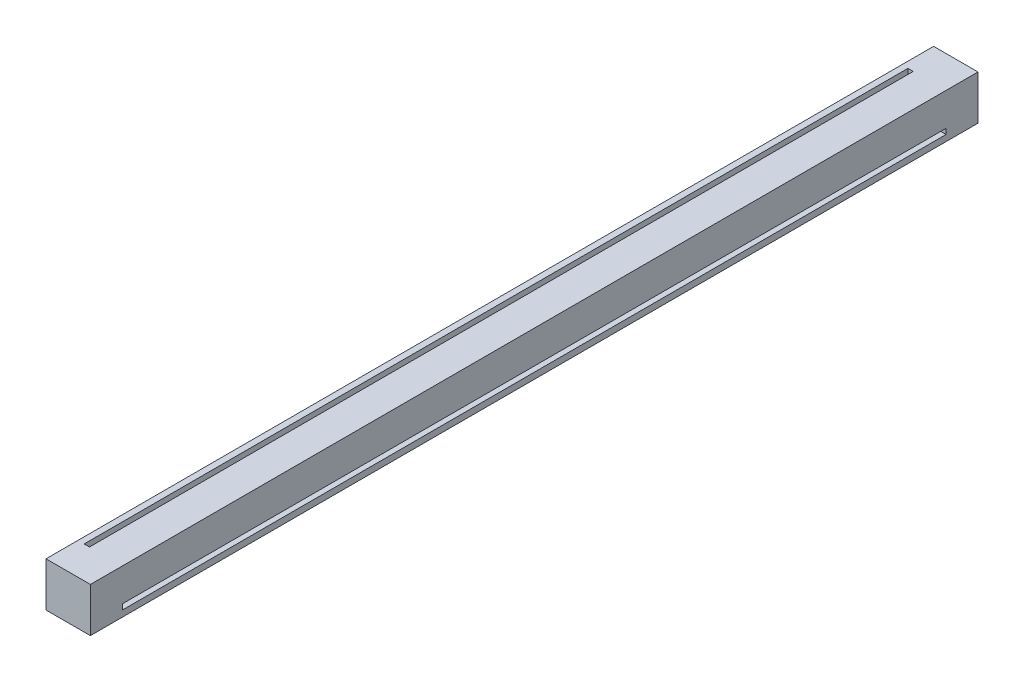
ISO-10303-21;
HEADER;
FILE_DESCRIPTION(('STEP AP214'),'2;1');
FILE_NAME('part.step','',(''),(''),'','','');
FILE_SCHEMA(('AUTOMOTIVE_DESIGN { 1 0 10303 214 1 1 1 1 }'));
ENDSEC;
DATA;
#1=APPLICATION_CONTEXT('core data for automotive mechanical design processes');
#2=APPLICATION_PROTOCOL_DEFINITION('international standard','automotive_design',2000,#1);
#3=PRODUCT_CONTEXT('',#1,'mechanical');
#4=PRODUCT('Part','Part','',(#3));
#5=PRODUCT_RELATED_PRODUCT_CATEGORY('part','',(#4));
#6=PRODUCT_DEFINITION_FORMATION('','',#4);
#7=PRODUCT_DEFINITION_CONTEXT('part definition',#1,'design');
#8=PRODUCT_DEFINITION('design','',#6,#7);
#9=PRODUCT_DEFINITION_SHAPE('','',#8);
#10=(LENGTH_UNIT() NAMED_UNIT(*) SI_UNIT(.MILLI.,.METRE.));
#11=(NAMED_UNIT(*) PLANE_ANGLE_UNIT() SI_UNIT($,.RADIAN.));
#12=(NAMED_UNIT(*) SI_UNIT($,.STERADIAN.) SOLID_ANGLE_UNIT());
#13=UNCERTAINTY_MEASURE_WITH_UNIT(LENGTH_MEASURE(1.E-05),#10,'distance_accuracy_value','');
#14=(GEOMETRIC_REPRESENTATION_CONTEXT(3) GLOBAL_UNCERTAINTY_ASSIGNED_CONTEXT((#13)) GLOBAL_UNIT_ASSIGNED_CONTEXT((#10,
#11,#12)) REPRESENTATION_CONTEXT('',''));
#15=CARTESIAN_POINT('',(0.,0.,0.));
#16=DIRECTION('',(0.,0.,1.));
#17=DIRECTION('',(1.,0.,0.));
#18=AXIS2_PLACEMENT_3D('',#15,#16,#17);
#19=CARTESIAN_POINT('',(0.,0.,500.));
#20=DIRECTION('',(1.,0.,0.));
#21=DIRECTION('',(0.,0.,-1.));
#22=AXIS2_PLACEMENT_3D('',#19,#20,#21);
#23=PLANE('',#22);
#24=DIRECTION('',(0.,-1.,0.));
#25=VECTOR('',#24,1.);
#26=CARTESIAN_POINT('',(0.,0.,0.));
#27=LINE('',#26,#25);
#28=CARTESIAN_POINT('',(0.,25.,0.));
#29=VERTEX_POINT('',#28);
#30=CARTESIAN_POINT('',(0.,0.,0.));
#31=VERTEX_POINT('',#30);
#32=EDGE_CURVE('E202',#29,#31,#27,.T.);
#33=ORIENTED_EDGE('',*,*,#32,.T.);
#34=DIRECTION('',(0.,0.,-1.));
#35=VECTOR('',#34,1.);
#36=CARTESIAN_POINT('',(0.,0.,500.));
#37=LINE('',#36,#35);
#38=CARTESIAN_POINT('',(0.,0.,500.));
#39=VERTEX_POINT('',#38);
#40=EDGE_CURVE('E11',#39,#31,#37,.T.);
#41=ORIENTED_EDGE('',*,*,#40,.F.);
#42=DIRECTION('',(0.,-1.,0.));
#43=VECTOR('',#42,1.);
#44=CARTESIAN_POINT('',(0.,0.,500.));
#45=LINE('',#44,#43);
#46=CARTESIAN_POINT('',(0.,25.,500.));
#47=VERTEX_POINT('',#46);
#48=EDGE_CURVE('E208',#47,#39,#45,.T.);
#49=ORIENTED_EDGE('',*,*,#48,.F.);
#50=DIRECTION('',(0.,0.,-1.));
#51=VECTOR('',#50,1.);
#52=CARTESIAN_POINT('',(0.,25.,500.));
#53=LINE('',#52,#51);
#54=EDGE_CURVE('E218',#47,#29,#53,.T.);
#55=ORIENTED_EDGE('',*,*,#54,.T.);
#56=EDGE_LOOP('',(#33,#41,#49,#55));
#57=FACE_BOUND('',#56,.T.);
#58=ADVANCED_FACE('F43',(#57),#23,.F.);
#59=CARTESIAN_POINT('',(0.,0.,500.));
#60=DIRECTION('',(0.,1.,0.));
#61=DIRECTION('',(0.,0.,1.));
#62=AXIS2_PLACEMENT_3D('',#59,#60,#61);
#63=PLANE('',#62);
#64=DIRECTION('',(1.,0.,0.));
#65=VECTOR('',#64,1.);
#66=CARTESIAN_POINT('',(0.,0.,0.));
#67=LINE('',#66,#65);
#68=CARTESIAN_POINT('',(25.,0.,0.));
#69=VERTEX_POINT('',#68);
#70=EDGE_CURVE('E221',#31,#69,#67,.T.);
#71=ORIENTED_EDGE('',*,*,#70,.T.);
#72=DIRECTION('',(0.,0.,-1.));
#73=VECTOR('',#72,1.);
#74=CARTESIAN_POINT('',(25.,0.,500.));
#75=LINE('',#74,#73);
#76=CARTESIAN_POINT('',(25.,0.,500.));
#77=VERTEX_POINT('',#76);
#78=EDGE_CURVE('E50',#77,#69,#75,.T.);
#79=ORIENTED_EDGE('',*,*,#78,.F.);
#80=DIRECTION('',(1.,0.,0.));
#81=VECTOR('',#80,1.);
#82=CARTESIAN_POINT('',(0.,0.,500.));
#83=LINE('',#82,#81);
#84=EDGE_CURVE('E211',#39,#77,#83,.T.);
#85=ORIENTED_EDGE('',*,*,#84,.F.);
#86=ORIENTED_EDGE('',*,*,#40,.T.);
#87=EDGE_LOOP('',(#71,#79,#85,#86));
#88=FACE_BOUND('',#87,.T.);
#89=ADVANCED_FACE('F251',(#88),#63,.F.);
#90=CARTESIAN_POINT('',(25.,0.,500.));
#91=DIRECTION('',(-1.,0.,0.));
#92=DIRECTION('',(0.,-1.,0.));
#93=AXIS2_PLACEMENT_3D('',#90,#91,#92);
#94=PLANE('',#93);
#95=DIRECTION('',(0.,0.,-1.));
#96=VECTOR('',#95,1.);
#97=CARTESIAN_POINT('',(25.,3.5,482.));
#98=LINE('',#97,#96);
#99=CARTESIAN_POINT('',(25.,3.5,482.));
#100=VERTEX_POINT('',#99);
#101=CARTESIAN_POINT('',(25.,3.5,18.));
#102=VERTEX_POINT('',#101);
#103=EDGE_CURVE('E144',#100,#102,#98,.T.);
#104=ORIENTED_EDGE('',*,*,#103,.F.);
#105=DIRECTION('',(0.,-1.,0.));
#106=VECTOR('',#105,1.);
#107=CARTESIAN_POINT('',(25.,3.5,482.));
#108=LINE('',#107,#106);
#109=CARTESIAN_POINT('',(25.,6.5,482.));
#110=VERTEX_POINT('',#109);
#111=EDGE_CURVE('E57',#110,#100,#108,.T.);
#112=ORIENTED_EDGE('',*,*,#111,.F.);
#113=DIRECTION('',(0.,0.,1.));
#114=VECTOR('',#113,1.);
#115=CARTESIAN_POINT('',(25.,6.5,482.));
#116=LINE('',#115,#114);
#117=CARTESIAN_POINT('',(25.,6.5,18.));
#118=VERTEX_POINT('',#117);
#119=EDGE_CURVE('E153',#118,#110,#116,.T.);
#120=ORIENTED_EDGE('',*,*,#119,.F.);
#121=DIRECTION('',(0.,1.,0.));
#122=VECTOR('',#121,1.);
#123=CARTESIAN_POINT('',(25.,3.5,18.));
#124=LINE('',#123,#122);
#125=EDGE_CURVE('E165',#102,#118,#124,.T.);
#126=ORIENTED_EDGE('',*,*,#125,.F.);
#127=EDGE_LOOP('',(#104,#112,#120,#126));
#128=FACE_BOUND('',#127,.T.);
#129=DIRECTION('',(0.,1.,0.));
#130=VECTOR('',#129,1.);
#131=CARTESIAN_POINT('',(25.,0.,0.));
#132=LINE('',#131,#130);
#133=CARTESIAN_POINT('',(25.,25.,0.));
#134=VERTEX_POINT('',#133);
#135=EDGE_CURVE('E223',#69,#134,#132,.T.);
#136=ORIENTED_EDGE('',*,*,#135,.T.);
#137=DIRECTION('',(0.,0.,-1.));
#138=VECTOR('',#137,1.);
#139=CARTESIAN_POINT('',(25.,25.,500.));
#140=LINE('',#139,#138);
#141=CARTESIAN_POINT('',(25.,25.,500.));
#142=VERTEX_POINT('',#141);
#143=EDGE_CURVE('E228',#142,#134,#140,.T.);
#144=ORIENTED_EDGE('',*,*,#143,.F.);
#145=DIRECTION('',(0.,1.,0.));
#146=VECTOR('',#145,1.);
#147=CARTESIAN_POINT('',(25.,0.,500.));
#148=LINE('',#147,#146);
#149=EDGE_CURVE('E214',#77,#142,#148,.T.);
#150=ORIENTED_EDGE('',*,*,#149,.F.);
#151=ORIENTED_EDGE('',*,*,#78,.T.);
#152=EDGE_LOOP('',(#136,#144,#150,#151));
#153=FACE_BOUND('',#152,.T.);
#154=ADVANCED_FACE('F235',(#128,#153),#94,.F.);
#155=CARTESIAN_POINT('',(0.,25.,500.));
#156=DIRECTION('',(0.,-1.,0.));
#157=DIRECTION('',(0.,0.,-1.));
#158=AXIS2_PLACEMENT_3D('',#155,#156,#157);
#159=PLANE('',#158);
#160=DIRECTION('',(-1.,0.,0.));
#161=VECTOR('',#160,1.);
#162=CARTESIAN_POINT('',(6.5,25.,18.));
#163=LINE('',#162,#161);
#164=CARTESIAN_POINT('',(6.5,25.,18.));
#165=VERTEX_POINT('',#164);
#166=CARTESIAN_POINT('',(3.5,25.,18.));
#167=VERTEX_POINT('',#166);
#168=EDGE_CURVE('E192',#165,#167,#163,.T.);
#169=ORIENTED_EDGE('',*,*,#168,.F.);
#170=DIRECTION('',(0.,0.,-1.));
#171=VECTOR('',#170,1.);
#172=CARTESIAN_POINT('',(6.5,25.,482.));
#173=LINE('',#172,#171);
#174=CARTESIAN_POINT('',(6.5,25.,482.));
#175=VERTEX_POINT('',#174);
#176=EDGE_CURVE('E65',#175,#165,#173,.T.);
#177=ORIENTED_EDGE('',*,*,#176,.F.);
#178=DIRECTION('',(1.,0.,0.));
#179=VECTOR('',#178,1.);
#180=CARTESIAN_POINT('',(6.5,25.,482.));
#181=LINE('',#180,#179);
#182=CARTESIAN_POINT('',(3.5,25.,482.));
#183=VERTEX_POINT('',#182);
#184=EDGE_CURVE('E181',#183,#175,#181,.T.);
#185=ORIENTED_EDGE('',*,*,#184,.F.);
#186=DIRECTION('',(0.,0.,1.));
#187=VECTOR('',#186,1.);
#188=CARTESIAN_POINT('',(3.5,25.,482.));
#189=LINE('',#188,#187);
#190=EDGE_CURVE('E195',#167,#183,#189,.T.);
#191=ORIENTED_EDGE('',*,*,#190,.F.);
#192=EDGE_LOOP('',(#169,#177,#185,#191));
#193=FACE_BOUND('',#192,.T.);
#194=DIRECTION('',(-1.,0.,0.));
#195=VECTOR('',#194,1.);
#196=CARTESIAN_POINT('',(0.,25.,0.));
#197=LINE('',#196,#195);
#198=EDGE_CURVE('E212',#134,#29,#197,.T.);
#199=ORIENTED_EDGE('',*,*,#198,.T.);
#200=ORIENTED_EDGE('',*,*,#54,.F.);
#201=DIRECTION('',(-1.,0.,0.));
#202=VECTOR('',#201,1.);
#203=CARTESIAN_POINT('',(0.,25.,500.));
#204=LINE('',#203,#202);
#205=EDGE_CURVE('E216',#142,#47,#204,.T.);
#206=ORIENTED_EDGE('',*,*,#205,.F.);
#207=ORIENTED_EDGE('',*,*,#143,.T.);
#208=EDGE_LOOP('',(#199,#200,#206,#207));
#209=FACE_BOUND('',#208,.T.);
#210=ADVANCED_FACE('F244',(#193,#209),#159,.F.);
#211=CARTESIAN_POINT('',(0.,0.,500.));
#212=DIRECTION('',(0.,0.,-1.));
#213=DIRECTION('',(-1.,0.,0.));
#214=AXIS2_PLACEMENT_3D('',#211,#212,#213);
#215=PLANE('',#214);
#216=ORIENTED_EDGE('',*,*,#48,.T.);
#217=ORIENTED_EDGE('',*,*,#84,.T.);
#218=ORIENTED_EDGE('',*,*,#149,.T.);
#219=ORIENTED_EDGE('',*,*,#205,.T.);
#220=EDGE_LOOP('',(#216,#217,#218,#219));
#221=FACE_BOUND('',#220,.T.);
#222=ADVANCED_FACE('F250',(#221),#215,.F.);
#223=CARTESIAN_POINT('',(0.,0.,0.));
#224=DIRECTION('',(0.,0.,-1.));
#225=DIRECTION('',(-1.,0.,0.));
#226=AXIS2_PLACEMENT_3D('',#223,#224,#225);
#227=PLANE('',#226);
#228=CARTESIAN_POINT('',(14.,10.,0.));
#229=DIRECTION('',(0.,0.,-1.));
#230=DIRECTION('',(-1.,0.,0.));
#231=AXIS2_PLACEMENT_3D('',#228,#229,#230);
#232=CIRCLE('',#231,1.49999999999999);
#233=CARTESIAN_POINT('',(12.5,10.,0.));
#234=VERTEX_POINT('',#233);
#235=EDGE_CURVE('E142',#234,#234,#232,.T.);
#236=ORIENTED_EDGE('',*,*,#235,.F.);
#237=EDGE_LOOP('',(#236));
#238=FACE_BOUND('',#237,.T.);
#239=ORIENTED_EDGE('',*,*,#32,.F.);
#240=ORIENTED_EDGE('',*,*,#198,.F.);
#241=ORIENTED_EDGE('',*,*,#135,.F.);
#242=ORIENTED_EDGE('',*,*,#70,.F.);
#243=EDGE_LOOP('',(#239,#240,#241,#242));
#244=FACE_BOUND('',#243,.T.);
#245=ADVANCED_FACE('F241',(#238,#244),#227,.T.);
#246=CARTESIAN_POINT('',(6.5,22.,482.));
#247=DIRECTION('',(1.,0.,0.));
#248=DIRECTION('',(0.,0.,-1.));
#249=AXIS2_PLACEMENT_3D('',#246,#247,#248);
#250=PLANE('',#249);
#251=ORIENTED_EDGE('',*,*,#176,.T.);
#252=DIRECTION('',(0.,1.,0.));
#253=VECTOR('',#252,1.);
#254=CARTESIAN_POINT('',(6.5,22.,18.));
#255=LINE('',#254,#253);
#256=CARTESIAN_POINT('',(6.5,22.,18.));
#257=VERTEX_POINT('',#256);
#258=EDGE_CURVE('E190',#257,#165,#255,.T.);
#259=ORIENTED_EDGE('',*,*,#258,.F.);
#260=DIRECTION('',(0.,0.,-1.));
#261=VECTOR('',#260,1.);
#262=CARTESIAN_POINT('',(6.5,22.,482.));
#263=LINE('',#262,#261);
#264=CARTESIAN_POINT('',(6.5,22.,482.));
#265=VERTEX_POINT('',#264);
#266=EDGE_CURVE('E177',#265,#257,#263,.T.);
#267=ORIENTED_EDGE('',*,*,#266,.F.);
#268=DIRECTION('',(0.,1.,0.));
#269=VECTOR('',#268,1.);
#270=CARTESIAN_POINT('',(6.5,22.,482.));
#271=LINE('',#270,#269);
#272=EDGE_CURVE('E200',#265,#175,#271,.T.);
#273=ORIENTED_EDGE('',*,*,#272,.T.);
#274=EDGE_LOOP('',(#251,#259,#267,#273));
#275=FACE_BOUND('',#274,.T.);
#276=ADVANCED_FACE('F266',(#275),#250,.F.);
#277=CARTESIAN_POINT('',(6.5,22.,482.));
#278=DIRECTION('',(0.,0.,1.));
#279=DIRECTION('',(1.,0.,0.));
#280=AXIS2_PLACEMENT_3D('',#277,#278,#279);
#281=PLANE('',#280);
#282=ORIENTED_EDGE('',*,*,#184,.T.);
#283=ORIENTED_EDGE('',*,*,#272,.F.);
#284=DIRECTION('',(1.,0.,0.));
#285=VECTOR('',#284,1.);
#286=CARTESIAN_POINT('',(6.5,22.,482.));
#287=LINE('',#286,#285);
#288=CARTESIAN_POINT('',(3.5,22.,482.));
#289=VERTEX_POINT('',#288);
#290=EDGE_CURVE('E187',#289,#265,#287,.T.);
#291=ORIENTED_EDGE('',*,*,#290,.F.);
#292=DIRECTION('',(0.,1.,0.));
#293=VECTOR('',#292,1.);
#294=CARTESIAN_POINT('',(3.5,22.,482.));
#295=LINE('',#294,#293);
#296=EDGE_CURVE('E203',#289,#183,#295,.T.);
#297=ORIENTED_EDGE('',*,*,#296,.T.);
#298=EDGE_LOOP('',(#282,#283,#291,#297));
#299=FACE_BOUND('',#298,.T.);
#300=ADVANCED_FACE('F272',(#299),#281,.F.);
#301=CARTESIAN_POINT('',(3.5,22.,482.));
#302=DIRECTION('',(-1.,0.,0.));
#303=DIRECTION('',(0.,0.,1.));
#304=AXIS2_PLACEMENT_3D('',#301,#302,#303);
#305=PLANE('',#304);
#306=ORIENTED_EDGE('',*,*,#190,.T.);
#307=ORIENTED_EDGE('',*,*,#296,.F.);
#308=DIRECTION('',(0.,0.,1.));
#309=VECTOR('',#308,1.);
#310=CARTESIAN_POINT('',(3.5,22.,482.));
#311=LINE('',#310,#309);
#312=CARTESIAN_POINT('',(3.5,22.,18.));
#313=VERTEX_POINT('',#312);
#314=EDGE_CURVE('E184',#313,#289,#311,.T.);
#315=ORIENTED_EDGE('',*,*,#314,.F.);
#316=DIRECTION('',(0.,1.,0.));
#317=VECTOR('',#316,1.);
#318=CARTESIAN_POINT('',(3.5,22.,18.));
#319=LINE('',#318,#317);
#320=EDGE_CURVE('E205',#313,#167,#319,.T.);
#321=ORIENTED_EDGE('',*,*,#320,.T.);
#322=EDGE_LOOP('',(#306,#307,#315,#321));
#323=FACE_BOUND('',#322,.T.);
#324=ADVANCED_FACE('F277',(#323),#305,.F.);
#325=CARTESIAN_POINT('',(6.5,22.,18.));
#326=DIRECTION('',(0.,0.,-1.));
#327=DIRECTION('',(-1.,0.,0.));
#328=AXIS2_PLACEMENT_3D('',#325,#326,#327);
#329=PLANE('',#328);
#330=ORIENTED_EDGE('',*,*,#168,.T.);
#331=ORIENTED_EDGE('',*,*,#320,.F.);
#332=DIRECTION('',(-1.,0.,0.));
#333=VECTOR('',#332,1.);
#334=CARTESIAN_POINT('',(6.5,22.,18.));
#335=LINE('',#334,#333);
#336=EDGE_CURVE('E180',#257,#313,#335,.T.);
#337=ORIENTED_EDGE('',*,*,#336,.F.);
#338=ORIENTED_EDGE('',*,*,#258,.T.);
#339=EDGE_LOOP('',(#330,#331,#337,#338));
#340=FACE_BOUND('',#339,.T.);
#341=ADVANCED_FACE('F273',(#340),#329,.F.);
#342=CARTESIAN_POINT('',(0.,22.,0.));
#343=DIRECTION('',(0.,1.,0.));
#344=DIRECTION('',(0.,0.,1.));
#345=AXIS2_PLACEMENT_3D('',#342,#343,#344);
#346=PLANE('',#345);
#347=ORIENTED_EDGE('',*,*,#266,.T.);
#348=ORIENTED_EDGE('',*,*,#336,.T.);
#349=ORIENTED_EDGE('',*,*,#314,.T.);
#350=ORIENTED_EDGE('',*,*,#290,.T.);
#351=EDGE_LOOP('',(#347,#348,#349,#350));
#352=FACE_BOUND('',#351,.T.);
#353=ADVANCED_FACE('F276',(#352),#346,.T.);
#354=CARTESIAN_POINT('',(22.,3.5,482.));
#355=DIRECTION('',(0.,0.,1.));
#356=DIRECTION('',(1.,0.,0.));
#357=AXIS2_PLACEMENT_3D('',#354,#355,#356);
#358=PLANE('',#357);
#359=ORIENTED_EDGE('',*,*,#111,.T.);
#360=DIRECTION('',(1.,0.,0.));
#361=VECTOR('',#360,1.);
#362=CARTESIAN_POINT('',(22.,3.5,482.));
#363=LINE('',#362,#361);
#364=CARTESIAN_POINT('',(22.,3.5,482.));
#365=VERTEX_POINT('',#364);
#366=EDGE_CURVE('E161',#365,#100,#363,.T.);
#367=ORIENTED_EDGE('',*,*,#366,.F.);
#368=DIRECTION('',(0.,-1.,0.));
#369=VECTOR('',#368,1.);
#370=CARTESIAN_POINT('',(22.,3.5,482.));
#371=LINE('',#370,#369);
#372=CARTESIAN_POINT('',(22.,6.5,482.));
#373=VERTEX_POINT('',#372);
#374=EDGE_CURVE('E149',#373,#365,#371,.T.);
#375=ORIENTED_EDGE('',*,*,#374,.F.);
#376=DIRECTION('',(1.,0.,0.));
#377=VECTOR('',#376,1.);
#378=CARTESIAN_POINT('',(22.,6.5,482.));
#379=LINE('',#378,#377);
#380=EDGE_CURVE('E170',#373,#110,#379,.T.);
#381=ORIENTED_EDGE('',*,*,#380,.T.);
#382=EDGE_LOOP('',(#359,#367,#375,#381));
#383=FACE_BOUND('',#382,.T.);
#384=ADVANCED_FACE('F287',(#383),#358,.F.);
#385=CARTESIAN_POINT('',(22.,6.5,482.));
#386=DIRECTION('',(0.,1.,0.));
#387=DIRECTION('',(-1.,0.,0.));
#388=AXIS2_PLACEMENT_3D('',#385,#386,#387);
#389=PLANE('',#388);
#390=ORIENTED_EDGE('',*,*,#119,.T.);
#391=ORIENTED_EDGE('',*,*,#380,.F.);
#392=DIRECTION('',(0.,0.,1.));
#393=VECTOR('',#392,1.);
#394=CARTESIAN_POINT('',(22.,6.5,482.));
#395=LINE('',#394,#393);
#396=CARTESIAN_POINT('',(22.,6.5,18.));
#397=VERTEX_POINT('',#396);
#398=EDGE_CURVE('E159',#397,#373,#395,.T.);
#399=ORIENTED_EDGE('',*,*,#398,.F.);
#400=DIRECTION('',(1.,0.,0.));
#401=VECTOR('',#400,1.);
#402=CARTESIAN_POINT('',(22.,6.5,18.));
#403=LINE('',#402,#401);
#404=EDGE_CURVE('E172',#397,#118,#403,.T.);
#405=ORIENTED_EDGE('',*,*,#404,.T.);
#406=EDGE_LOOP('',(#390,#391,#399,#405));
#407=FACE_BOUND('',#406,.T.);
#408=ADVANCED_FACE('F291',(#407),#389,.F.);
#409=CARTESIAN_POINT('',(22.,3.5,18.));
#410=DIRECTION('',(0.,0.,-1.));
#411=DIRECTION('',(-1.,0.,0.));
#412=AXIS2_PLACEMENT_3D('',#409,#410,#411);
#413=PLANE('',#412);
#414=ORIENTED_EDGE('',*,*,#125,.T.);
#415=ORIENTED_EDGE('',*,*,#404,.F.);
#416=DIRECTION('',(0.,1.,0.));
#417=VECTOR('',#416,1.);
#418=CARTESIAN_POINT('',(22.,3.5,18.));
#419=LINE('',#418,#417);
#420=CARTESIAN_POINT('',(22.,3.5,18.));
#421=VERTEX_POINT('',#420);
#422=EDGE_CURVE('E156',#421,#397,#419,.T.);
#423=ORIENTED_EDGE('',*,*,#422,.F.);
#424=DIRECTION('',(1.,0.,0.));
#425=VECTOR('',#424,1.);
#426=CARTESIAN_POINT('',(22.,3.5,18.));
#427=LINE('',#426,#425);
#428=EDGE_CURVE('E174',#421,#102,#427,.T.);
#429=ORIENTED_EDGE('',*,*,#428,.T.);
#430=EDGE_LOOP('',(#414,#415,#423,#429));
#431=FACE_BOUND('',#430,.T.);
#432=ADVANCED_FACE('F295',(#431),#413,.F.);
#433=CARTESIAN_POINT('',(22.,3.5,482.));
#434=DIRECTION('',(0.,-1.,0.));
#435=DIRECTION('',(1.,0.,0.));
#436=AXIS2_PLACEMENT_3D('',#433,#434,#435);
#437=PLANE('',#436);
#438=ORIENTED_EDGE('',*,*,#103,.T.);
#439=ORIENTED_EDGE('',*,*,#428,.F.);
#440=DIRECTION('',(0.,0.,-1.));
#441=VECTOR('',#440,1.);
#442=CARTESIAN_POINT('',(22.,3.5,482.));
#443=LINE('',#442,#441);
#444=EDGE_CURVE('E152',#365,#421,#443,.T.);
#445=ORIENTED_EDGE('',*,*,#444,.F.);
#446=ORIENTED_EDGE('',*,*,#366,.T.);
#447=EDGE_LOOP('',(#438,#439,#445,#446));
#448=FACE_BOUND('',#447,.T.);
#449=ADVANCED_FACE('F292',(#448),#437,.F.);
#450=CARTESIAN_POINT('',(22.,0.,0.));
#451=DIRECTION('',(-1.,0.,0.));
#452=DIRECTION('',(0.,-1.,0.));
#453=AXIS2_PLACEMENT_3D('',#450,#451,#452);
#454=PLANE('',#453);
#455=ORIENTED_EDGE('',*,*,#374,.T.);
#456=ORIENTED_EDGE('',*,*,#444,.T.);
#457=ORIENTED_EDGE('',*,*,#422,.T.);
#458=ORIENTED_EDGE('',*,*,#398,.T.);
#459=EDGE_LOOP('',(#455,#456,#457,#458));
#460=FACE_BOUND('',#459,.T.);
#461=ADVANCED_FACE('F136',(#460),#454,.F.);
#462=CARTESIAN_POINT('',(14.,10.,16.));
#463=DIRECTION('',(0.,0.,-1.));
#464=DIRECTION('',(-1.,0.,0.));
#465=AXIS2_PLACEMENT_3D('',#462,#463,#464);
#466=CONICAL_SURFACE('',#465,1.5,1.02974425867665);
#467=CARTESIAN_POINT('',(14.,10.,16.9012909285413));
#468=VERTEX_POINT('',#467);
#469=VERTEX_LOOP('',#468);
#470=FACE_BOUND('',#469,.T.);
#471=CARTESIAN_POINT('',(14.,10.,16.));
#472=DIRECTION('',(0.,0.,-1.));
#473=DIRECTION('',(-1.,0.,0.));
#474=AXIS2_PLACEMENT_3D('',#471,#472,#473);
#475=CIRCLE('',#474,1.5);
#476=CARTESIAN_POINT('',(12.5,10.,16.));
#477=VERTEX_POINT('',#476);
#478=EDGE_CURVE('E140',#477,#477,#475,.T.);
#479=ORIENTED_EDGE('',*,*,#478,.T.);
#480=EDGE_LOOP('',(#479));
#481=FACE_BOUND('',#480,.T.);
#482=ADVANCED_FACE('F132',(#470,#481),#466,.F.);
#483=CARTESIAN_POINT('',(14.,10.,0.));
#484=DIRECTION('',(0.,0.,-1.));
#485=DIRECTION('',(-1.,0.,0.));
#486=AXIS2_PLACEMENT_3D('',#483,#484,#485);
#487=CYLINDRICAL_SURFACE('',#486,1.49999999999999);
#488=ORIENTED_EDGE('',*,*,#478,.F.);
#489=EDGE_LOOP('',(#488));
#490=FACE_BOUND('',#489,.T.);
#491=ORIENTED_EDGE('',*,*,#235,.T.);
#492=EDGE_LOOP('',(#491));
#493=FACE_BOUND('',#492,.T.);
#494=ADVANCED_FACE('F135',(#490,#493),#487,.F.);
#495=CLOSED_SHELL('',(#58,#89,#154,#210,#222,#245,#276,#300,#324,#341,#353,#384,#408,#432,#449,
#461,#482,#494));
#496=MANIFOLD_SOLID_BREP('B2',#495);
#497=ADVANCED_BREP_SHAPE_REPRESENTATION('',(#18,#496),#14);
#498=SHAPE_DEFINITION_REPRESENTATION(#9,#497);
ENDSEC;
END-ISO-10303-21;
